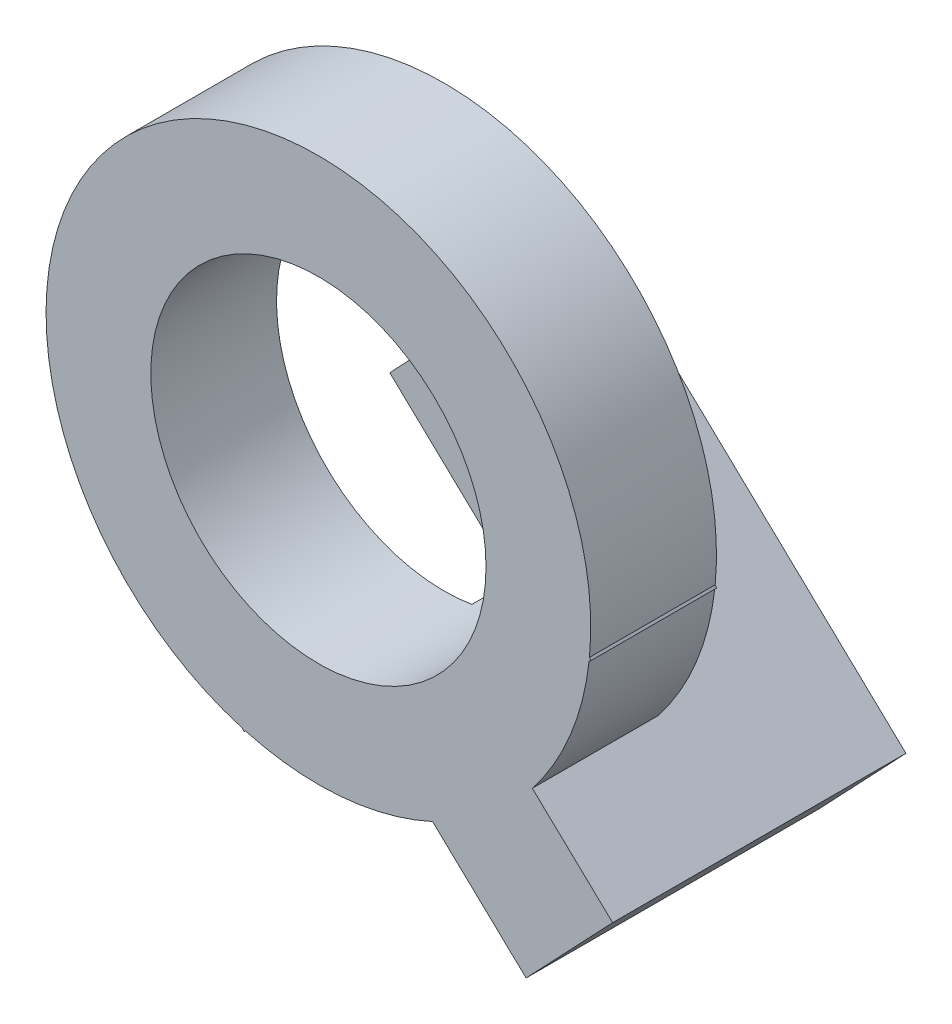
ISO-10303-21;
HEADER;
FILE_DESCRIPTION(('STEP AP214'),'2;1');
FILE_NAME('part.step','',(''),(''),'','','');
FILE_SCHEMA(('AUTOMOTIVE_DESIGN { 1 0 10303 214 1 1 1 1 }'));
ENDSEC;
DATA;
#1=APPLICATION_CONTEXT('core data for automotive mechanical design processes');
#2=APPLICATION_PROTOCOL_DEFINITION('international standard','automotive_design',2000,#1);
#3=PRODUCT_CONTEXT('',#1,'mechanical');
#4=PRODUCT('Part','Part','',(#3));
#5=PRODUCT_RELATED_PRODUCT_CATEGORY('part','',(#4));
#6=PRODUCT_DEFINITION_FORMATION('','',#4);
#7=PRODUCT_DEFINITION_CONTEXT('part definition',#1,'design');
#8=PRODUCT_DEFINITION('design','',#6,#7);
#9=PRODUCT_DEFINITION_SHAPE('','',#8);
#10=(LENGTH_UNIT() NAMED_UNIT(*) SI_UNIT(.MILLI.,.METRE.));
#11=(NAMED_UNIT(*) PLANE_ANGLE_UNIT() SI_UNIT($,.RADIAN.));
#12=(NAMED_UNIT(*) SI_UNIT($,.STERADIAN.) SOLID_ANGLE_UNIT());
#13=UNCERTAINTY_MEASURE_WITH_UNIT(LENGTH_MEASURE(1.E-05),#10,'distance_accuracy_value','');
#14=(GEOMETRIC_REPRESENTATION_CONTEXT(3) GLOBAL_UNCERTAINTY_ASSIGNED_CONTEXT((#13)) GLOBAL_UNIT_ASSIGNED_CONTEXT((#10,
#11,#12)) REPRESENTATION_CONTEXT('',''));
#15=CARTESIAN_POINT('',(0.,0.,0.));
#16=DIRECTION('',(0.,0.,1.));
#17=DIRECTION('',(1.,0.,0.));
#18=AXIS2_PLACEMENT_3D('',#15,#16,#17);
#19=CARTESIAN_POINT('',(44.03139663398,44.838982649365,57.5));
#20=DIRECTION('',(-0.560562494966211,0.828112123590312,0.));
#21=DIRECTION('',(0.,0.,1.));
#22=AXIS2_PLACEMENT_3D('',#19,#20,#21);
#23=PLANE('',#22);
#24=DIRECTION('',(0.,0.,1.));
#25=VECTOR('',#24,1.);
#26=CARTESIAN_POINT('',(35.750275398078,39.233357699701,57.5));
#27=LINE('',#26,#25);
#28=CARTESIAN_POINT('',(35.750275398078,39.233357699701,57.5));
#29=VERTEX_POINT('',#28);
#30=CARTESIAN_POINT('',(35.750275398078,39.233357699701,60.5));
#31=VERTEX_POINT('',#30);
#32=EDGE_CURVE('E24',#29,#31,#27,.T.);
#33=ORIENTED_EDGE('',*,*,#32,.F.);
#34=DIRECTION('',(-0.828112123590312,-0.560562494966211,0.));
#35=VECTOR('',#34,1.);
#36=CARTESIAN_POINT('',(44.03139663398,44.838982649365,57.5));
#37=LINE('',#36,#35);
#38=CARTESIAN_POINT('',(35.792555747973,39.261977952624,57.5));
#39=VERTEX_POINT('',#38);
#40=EDGE_CURVE('E198',#39,#29,#37,.T.);
#41=ORIENTED_EDGE('',*,*,#40,.F.);
#42=DIRECTION('',(0.,0.,1.));
#43=VECTOR('',#42,1.);
#44=CARTESIAN_POINT('',(35.792555747973,39.261977952624,57.5));
#45=LINE('',#44,#43);
#46=CARTESIAN_POINT('',(35.792555747973,39.261977952624,60.5));
#47=VERTEX_POINT('',#46);
#48=EDGE_CURVE('E9',#39,#47,#45,.T.);
#49=ORIENTED_EDGE('',*,*,#48,.T.);
#50=DIRECTION('',(-0.828112123590312,-0.560562494966211,0.));
#51=VECTOR('',#50,1.);
#52=CARTESIAN_POINT('',(44.03139663398,44.838982649365,60.5));
#53=LINE('',#52,#51);
#54=EDGE_CURVE('E225',#47,#31,#53,.T.);
#55=ORIENTED_EDGE('',*,*,#54,.T.);
#56=EDGE_LOOP('',(#33,#41,#49,#55));
#57=FACE_BOUND('',#56,.T.);
#58=ADVANCED_FACE('F15',(#57),#23,.F.);
#59=CARTESIAN_POINT('',(37.528614996388,45.525850419875,57.5));
#60=DIRECTION('',(0.,0.,1.));
#61=DIRECTION('',(1.,0.,0.));
#62=AXIS2_PLACEMENT_3D('',#59,#60,#61);
#63=CYLINDRICAL_SURFACE('',#62,6.5);
#64=CARTESIAN_POINT('',(37.528614996388,45.525850419875,60.5));
#65=DIRECTION('',(0.,0.,1.));
#66=DIRECTION('',(1.,0.,0.));
#67=AXIS2_PLACEMENT_3D('',#64,#65,#66);
#68=CIRCLE('',#67,6.5);
#69=CARTESIAN_POINT('',(40.253172476418,39.624428003372,60.5));
#70=VERTEX_POINT('',#69);
#71=EDGE_CURVE('E226',#47,#70,#68,.T.);
#72=ORIENTED_EDGE('',*,*,#71,.F.);
#73=ORIENTED_EDGE('',*,*,#48,.F.);
#74=CARTESIAN_POINT('',(37.528614996388,45.525850419875,57.5));
#75=DIRECTION('',(0.,0.,1.));
#76=DIRECTION('',(1.,0.,0.));
#77=AXIS2_PLACEMENT_3D('',#74,#75,#76);
#78=CIRCLE('',#77,6.5);
#79=CARTESIAN_POINT('',(40.253172476418,39.624428003372,57.5));
#80=VERTEX_POINT('',#79);
#81=EDGE_CURVE('E193',#39,#80,#78,.T.);
#82=ORIENTED_EDGE('',*,*,#81,.T.);
#83=DIRECTION('',(0.,0.,1.));
#84=VECTOR('',#83,1.);
#85=CARTESIAN_POINT('',(40.253172476418,39.624428003372,57.5));
#86=LINE('',#85,#84);
#87=EDGE_CURVE('E18',#80,#70,#86,.T.);
#88=ORIENTED_EDGE('',*,*,#87,.T.);
#89=EDGE_LOOP('',(#72,#73,#82,#88));
#90=FACE_BOUND('',#89,.T.);
#91=ADVANCED_FACE('F330',(#90),#63,.T.);
#92=CARTESIAN_POINT('',(35.750275398078,39.233357699701,57.5));
#93=DIRECTION('',(-0.828112123590312,-0.560562494966211,0.));
#94=DIRECTION('',(-0.560562494966211,0.828112123590312,0.));
#95=AXIS2_PLACEMENT_3D('',#92,#93,#94);
#96=PLANE('',#95);
#97=DIRECTION('',(-0.560562494966211,0.828112123590312,0.));
#98=VECTOR('',#97,1.);
#99=CARTESIAN_POINT('',(35.750275398078,39.233357699701,57.5));
#100=LINE('',#99,#98);
#101=CARTESIAN_POINT('',(35.716245277109,39.283629981551,57.5));
#102=VERTEX_POINT('',#101);
#103=EDGE_CURVE('E273',#29,#102,#100,.T.);
#104=ORIENTED_EDGE('',*,*,#103,.F.);
#105=ORIENTED_EDGE('',*,*,#32,.T.);
#106=DIRECTION('',(-0.560562494966211,0.828112123590312,0.));
#107=VECTOR('',#106,1.);
#108=CARTESIAN_POINT('',(35.750275398078,39.233357699701,60.5));
#109=LINE('',#108,#107);
#110=CARTESIAN_POINT('',(35.716245277109,39.283629981551,60.5));
#111=VERTEX_POINT('',#110);
#112=EDGE_CURVE('E210',#31,#111,#109,.T.);
#113=ORIENTED_EDGE('',*,*,#112,.T.);
#114=DIRECTION('',(0.,0.,1.));
#115=VECTOR('',#114,1.);
#116=CARTESIAN_POINT('',(35.716245277109,39.283629981551,57.5));
#117=LINE('',#116,#115);
#118=EDGE_CURVE('E304',#102,#111,#117,.T.);
#119=ORIENTED_EDGE('',*,*,#118,.F.);
#120=EDGE_LOOP('',(#104,#105,#113,#119));
#121=FACE_BOUND('',#120,.T.);
#122=ADVANCED_FACE('F369',(#121),#96,.T.);
#123=CARTESIAN_POINT('',(42.48517600755,37.506335739546,53.5));
#124=DIRECTION('',(0.688354575694027,0.725374371012029,0.));
#125=DIRECTION('',(0.,0.,-1.));
#126=AXIS2_PLACEMENT_3D('',#123,#124,#125);
#127=PLANE('',#126);
#128=ORIENTED_EDGE('',*,*,#87,.F.);
#129=DIRECTION('',(0.725374371012029,-0.688354575694027,0.));
#130=VECTOR('',#129,1.);
#131=CARTESIAN_POINT('',(38.191251341143,41.581118100109,57.5));
#132=LINE('',#131,#130);
#133=CARTESIAN_POINT('',(38.191251341143,41.581118100109,57.5));
#134=VERTEX_POINT('',#133);
#135=EDGE_CURVE('E197',#134,#80,#132,.T.);
#136=ORIENTED_EDGE('',*,*,#135,.F.);
#137=DIRECTION('',(0.,0.,1.));
#138=VECTOR('',#137,1.);
#139=CARTESIAN_POINT('',(38.191251341143,41.581118100109,56.5));
#140=LINE('',#139,#138);
#141=CARTESIAN_POINT('',(38.191251341143,41.581118100109,56.5));
#142=VERTEX_POINT('',#141);
#143=EDGE_CURVE('E243',#142,#134,#140,.T.);
#144=ORIENTED_EDGE('',*,*,#143,.F.);
#145=DIRECTION('',(0.725374371012029,-0.688354575694027,0.));
#146=VECTOR('',#145,1.);
#147=CARTESIAN_POINT('',(39.179053111167,40.643729221418,56.5));
#148=LINE('',#147,#146);
#149=CARTESIAN_POINT('',(35.231432297427,44.389881496483,56.5));
#150=VERTEX_POINT('',#149);
#151=EDGE_CURVE('E239',#150,#142,#148,.T.);
#152=ORIENTED_EDGE('',*,*,#151,.F.);
#153=DIRECTION('',(0.,0.,1.));
#154=VECTOR('',#153,1.);
#155=CARTESIAN_POINT('',(35.231432297427,44.389881496483,53.5));
#156=LINE('',#155,#154);
#157=CARTESIAN_POINT('',(35.231432297427,44.389881496483,53.5));
#158=VERTEX_POINT('',#157);
#159=EDGE_CURVE('E305',#158,#150,#156,.T.);
#160=ORIENTED_EDGE('',*,*,#159,.F.);
#161=DIRECTION('',(-0.725374371012029,0.688354575694027,0.));
#162=VECTOR('',#161,1.);
#163=CARTESIAN_POINT('',(42.48517600755,37.506335739546,53.5));
#164=LINE('',#163,#162);
#165=CARTESIAN_POINT('',(42.48517600755,37.506335739546,53.5));
#166=VERTEX_POINT('',#165);
#167=EDGE_CURVE('E46',#166,#158,#164,.T.);
#168=ORIENTED_EDGE('',*,*,#167,.F.);
#169=DIRECTION('',(0.,0.,1.));
#170=VECTOR('',#169,1.);
#171=CARTESIAN_POINT('',(42.48517600755,37.506335739546,53.5));
#172=LINE('',#171,#170);
#173=CARTESIAN_POINT('',(42.48517600755,37.506335739546,60.5));
#174=VERTEX_POINT('',#173);
#175=EDGE_CURVE('E40',#166,#174,#172,.T.);
#176=ORIENTED_EDGE('',*,*,#175,.T.);
#177=DIRECTION('',(-0.725374371012029,0.688354575694027,0.));
#178=VECTOR('',#177,1.);
#179=CARTESIAN_POINT('',(42.48517600755,37.506335739546,60.5));
#180=LINE('',#179,#178);
#181=EDGE_CURVE('E201',#174,#70,#180,.T.);
#182=ORIENTED_EDGE('',*,*,#181,.T.);
#183=EDGE_LOOP('',(#128,#136,#144,#152,#160,#168,#176,#182));
#184=FACE_BOUND('',#183,.T.);
#185=ADVANCED_FACE('F335',(#184),#127,.F.);
#186=CARTESIAN_POINT('',(42.48517600755,37.506335739546,53.5));
#187=DIRECTION('',(-0.725374371012029,0.688354575694027,0.));
#188=DIRECTION('',(0.,0.,1.));
#189=AXIS2_PLACEMENT_3D('',#186,#187,#188);
#190=PLANE('',#189);
#191=DIRECTION('',(0.,0.,1.));
#192=VECTOR('',#191,1.);
#193=CARTESIAN_POINT('',(44.550239734631,39.682458852583,53.5));
#194=LINE('',#193,#192);
#195=CARTESIAN_POINT('',(44.550239734631,39.682458852583,53.5));
#196=VERTEX_POINT('',#195);
#197=CARTESIAN_POINT('',(44.550239734631,39.682458852583,60.5));
#198=VERTEX_POINT('',#197);
#199=EDGE_CURVE('E257',#196,#198,#194,.T.);
#200=ORIENTED_EDGE('',*,*,#199,.T.);
#201=DIRECTION('',(0.688354575694027,0.725374371012029,0.));
#202=VECTOR('',#201,1.);
#203=CARTESIAN_POINT('',(42.48517600755,37.506335739546,60.5));
#204=LINE('',#203,#202);
#205=EDGE_CURVE('E196',#174,#198,#204,.T.);
#206=ORIENTED_EDGE('',*,*,#205,.F.);
#207=ORIENTED_EDGE('',*,*,#175,.F.);
#208=DIRECTION('',(0.688354575694027,0.725374371012029,0.));
#209=VECTOR('',#208,1.);
#210=CARTESIAN_POINT('',(42.48517600755,37.506335739546,53.5));
#211=LINE('',#210,#209);
#212=EDGE_CURVE('E312',#166,#196,#211,.T.);
#213=ORIENTED_EDGE('',*,*,#212,.T.);
#214=EDGE_LOOP('',(#200,#206,#207,#213));
#215=FACE_BOUND('',#214,.T.);
#216=ADVANCED_FACE('F358',(#215),#190,.F.);
#217=CARTESIAN_POINT('',(42.48517600755,37.506335739546,53.5));
#218=DIRECTION('',(0.,0.,1.));
#219=DIRECTION('',(1.,0.,0.));
#220=AXIS2_PLACEMENT_3D('',#217,#218,#219);
#221=PLANE('',#220);
#222=DIRECTION('',(0.688354575694027,0.725374371012029,0.));
#223=VECTOR('',#222,1.);
#224=CARTESIAN_POINT('',(35.231432297427,44.389881496483,53.5));
#225=LINE('',#224,#223);
#226=CARTESIAN_POINT('',(37.296496024508,46.56600460952,53.5));
#227=VERTEX_POINT('',#226);
#228=EDGE_CURVE('E285',#158,#227,#225,.T.);
#229=ORIENTED_EDGE('',*,*,#228,.T.);
#230=DIRECTION('',(-0.725374371012029,0.688354575694027,0.));
#231=VECTOR('',#230,1.);
#232=CARTESIAN_POINT('',(44.550239734631,39.682458852583,53.5));
#233=LINE('',#232,#231);
#234=EDGE_CURVE('E263',#196,#227,#233,.T.);
#235=ORIENTED_EDGE('',*,*,#234,.F.);
#236=ORIENTED_EDGE('',*,*,#212,.F.);
#237=ORIENTED_EDGE('',*,*,#167,.T.);
#238=EDGE_LOOP('',(#229,#235,#236,#237));
#239=FACE_BOUND('',#238,.T.);
#240=ADVANCED_FACE('F356',(#239),#221,.F.);
#241=CARTESIAN_POINT('',(35.231432297427,44.389881496483,53.5));
#242=DIRECTION('',(-0.725374371012029,0.688354575694027,0.));
#243=DIRECTION('',(0.,0.,1.));
#244=AXIS2_PLACEMENT_3D('',#241,#242,#243);
#245=PLANE('',#244);
#246=DIRECTION('',(0.,0.,1.));
#247=VECTOR('',#246,1.);
#248=CARTESIAN_POINT('',(37.296496024508,46.56600460952,53.5));
#249=LINE('',#248,#247);
#250=CARTESIAN_POINT('',(37.296496024508,46.56600460952,56.5));
#251=VERTEX_POINT('',#250);
#252=EDGE_CURVE('E295',#227,#251,#249,.T.);
#253=ORIENTED_EDGE('',*,*,#252,.F.);
#254=ORIENTED_EDGE('',*,*,#228,.F.);
#255=ORIENTED_EDGE('',*,*,#159,.T.);
#256=DIRECTION('',(0.688354575694027,0.725374371012029,0.));
#257=VECTOR('',#256,1.);
#258=CARTESIAN_POINT('',(36.059274688229,45.262245354776,56.5));
#259=LINE('',#258,#257);
#260=EDGE_CURVE('E242',#150,#251,#259,.T.);
#261=ORIENTED_EDGE('',*,*,#260,.T.);
#262=EDGE_LOOP('',(#253,#254,#255,#261));
#263=FACE_BOUND('',#262,.T.);
#264=ADVANCED_FACE('F352',(#263),#245,.T.);
#265=CARTESIAN_POINT('',(37.528614996388,45.525850419875,56.5));
#266=DIRECTION('',(0.,0.,1.));
#267=DIRECTION('',(1.,0.,0.));
#268=AXIS2_PLACEMENT_3D('',#265,#266,#267);
#269=PLANE('',#268);
#270=ORIENTED_EDGE('',*,*,#151,.T.);
#271=CARTESIAN_POINT('',(37.528614996388,45.525850419875,56.5));
#272=DIRECTION('',(0.,0.,1.));
#273=DIRECTION('',(1.,0.,0.));
#274=AXIS2_PLACEMENT_3D('',#271,#272,#273);
#275=CIRCLE('',#274,4.);
#276=CARTESIAN_POINT('',(40.807242216564,43.23443087053,56.5));
#277=VERTEX_POINT('',#276);
#278=EDGE_CURVE('E252',#142,#277,#275,.T.);
#279=ORIENTED_EDGE('',*,*,#278,.T.);
#280=DIRECTION('',(0.725374371012029,-0.688354575694027,0.));
#281=VECTOR('',#280,1.);
#282=CARTESIAN_POINT('',(41.244116838248,42.819852334455,56.5));
#283=LINE('',#282,#281);
#284=EDGE_CURVE('E294',#251,#277,#283,.T.);
#285=ORIENTED_EDGE('',*,*,#284,.F.);
#286=ORIENTED_EDGE('',*,*,#260,.F.);
#287=EDGE_LOOP('',(#270,#279,#285,#286));
#288=FACE_BOUND('',#287,.T.);
#289=ADVANCED_FACE('F347',(#288),#269,.T.);
#290=CARTESIAN_POINT('',(37.528614996388,45.525850419875,56.5));
#291=DIRECTION('',(0.,0.,1.));
#292=DIRECTION('',(1.,0.,0.));
#293=AXIS2_PLACEMENT_3D('',#290,#291,#292);
#294=CYLINDRICAL_SURFACE('',#293,4.);
#295=DIRECTION('',(0.,0.,1.));
#296=VECTOR('',#295,1.);
#297=CARTESIAN_POINT('',(41.528614996388,45.525850419875,56.5));
#298=LINE('',#297,#296);
#299=CARTESIAN_POINT('',(41.528614996388,45.525850419875,57.5));
#300=VERTEX_POINT('',#299);
#301=CARTESIAN_POINT('',(41.528614996388,45.525850419875,60.5));
#302=VERTEX_POINT('',#301);
#303=EDGE_CURVE('E306',#300,#302,#298,.T.);
#304=ORIENTED_EDGE('',*,*,#303,.F.);
#305=CARTESIAN_POINT('',(37.528614996388,45.525850419875,57.5));
#306=DIRECTION('',(0.,0.,1.));
#307=DIRECTION('',(1.,0.,0.));
#308=AXIS2_PLACEMENT_3D('',#305,#306,#307);
#309=CIRCLE('',#308,4.);
#310=CARTESIAN_POINT('',(40.807242216564,43.23443087053,57.5));
#311=VERTEX_POINT('',#310);
#312=EDGE_CURVE('E254',#311,#300,#309,.T.);
#313=ORIENTED_EDGE('',*,*,#312,.F.);
#314=DIRECTION('',(0.,0.,1.));
#315=VECTOR('',#314,1.);
#316=CARTESIAN_POINT('',(40.807242216564,43.23443087053,56.5));
#317=LINE('',#316,#315);
#318=EDGE_CURVE('E297',#277,#311,#317,.T.);
#319=ORIENTED_EDGE('',*,*,#318,.F.);
#320=ORIENTED_EDGE('',*,*,#278,.F.);
#321=ORIENTED_EDGE('',*,*,#143,.T.);
#322=CARTESIAN_POINT('',(37.528614996388,45.525850419875,57.5));
#323=DIRECTION('',(0.,0.,1.));
#324=DIRECTION('',(1.,0.,0.));
#325=AXIS2_PLACEMENT_3D('',#322,#323,#324);
#326=CIRCLE('',#325,4.);
#327=EDGE_CURVE('E259',#300,#134,#326,.T.);
#328=ORIENTED_EDGE('',*,*,#327,.F.);
#329=ORIENTED_EDGE('',*,*,#303,.T.);
#330=CARTESIAN_POINT('',(37.528614996388,45.525850419875,60.5));
#331=DIRECTION('',(0.,0.,-1.));
#332=DIRECTION('',(1.,0.,0.));
#333=AXIS2_PLACEMENT_3D('',#330,#331,#332);
#334=CIRCLE('',#333,4.);
#335=EDGE_CURVE('E237',#302,#302,#334,.T.);
#336=ORIENTED_EDGE('',*,*,#335,.F.);
#337=EDGE_LOOP('',(#304,#313,#319,#320,#321,#328,#329,#336));
#338=FACE_BOUND('',#337,.T.);
#339=ADVANCED_FACE('F344',(#338),#294,.F.);
#340=CARTESIAN_POINT('',(37.528614996388,45.525850419875,57.5));
#341=DIRECTION('',(0.,0.,1.));
#342=DIRECTION('',(1.,0.,0.));
#343=AXIS2_PLACEMENT_3D('',#340,#341,#342);
#344=CYLINDRICAL_SURFACE('',#343,6.5);
#345=CARTESIAN_POINT('',(37.528614996388,45.525850419875,57.5));
#346=DIRECTION('',(0.,0.,-1.));
#347=DIRECTION('',(-0.278826110658059,-0.960341605896204,0.));
#348=AXIS2_PLACEMENT_3D('',#345,#346,#347);
#349=CIRCLE('',#348,6.5);
#350=CARTESIAN_POINT('',(43.997366513011,44.889254931214,57.5));
#351=VERTEX_POINT('',#350);
#352=EDGE_CURVE('E279',#102,#351,#349,.T.);
#353=ORIENTED_EDGE('',*,*,#352,.F.);
#354=ORIENTED_EDGE('',*,*,#118,.T.);
#355=CARTESIAN_POINT('',(37.528614996388,45.525850419875,60.5));
#356=DIRECTION('',(0.,0.,1.));
#357=DIRECTION('',(0.995192541018966,-0.0979377674863666,0.));
#358=AXIS2_PLACEMENT_3D('',#355,#356,#357);
#359=CIRCLE('',#358,6.5);
#360=CARTESIAN_POINT('',(43.997366513011,44.889254931214,60.5));
#361=VERTEX_POINT('',#360);
#362=EDGE_CURVE('E204',#361,#111,#359,.T.);
#363=ORIENTED_EDGE('',*,*,#362,.F.);
#364=DIRECTION('',(0.,0.,1.));
#365=VECTOR('',#364,1.);
#366=CARTESIAN_POINT('',(43.997366513011,44.889254931214,57.5));
#367=LINE('',#366,#365);
#368=EDGE_CURVE('E262',#351,#361,#367,.T.);
#369=ORIENTED_EDGE('',*,*,#368,.F.);
#370=EDGE_LOOP('',(#353,#354,#363,#369));
#371=FACE_BOUND('',#370,.T.);
#372=ADVANCED_FACE('F370',(#371),#344,.T.);
#373=CARTESIAN_POINT('',(44.550239734631,39.682458852583,53.5));
#374=DIRECTION('',(0.688354575694027,0.725374371012029,0.));
#375=DIRECTION('',(0.,0.,-1.));
#376=AXIS2_PLACEMENT_3D('',#373,#374,#375);
#377=PLANE('',#376);
#378=DIRECTION('',(-0.725374371012029,0.688354575694027,0.));
#379=VECTOR('',#378,1.);
#380=CARTESIAN_POINT('',(44.550239734631,39.682458852583,60.5));
#381=LINE('',#380,#379);
#382=CARTESIAN_POINT('',(42.633150498099,41.501708609282,60.5));
#383=VERTEX_POINT('',#382);
#384=EDGE_CURVE('E205',#198,#383,#381,.T.);
#385=ORIENTED_EDGE('',*,*,#384,.F.);
#386=ORIENTED_EDGE('',*,*,#199,.F.);
#387=ORIENTED_EDGE('',*,*,#234,.T.);
#388=ORIENTED_EDGE('',*,*,#252,.T.);
#389=ORIENTED_EDGE('',*,*,#284,.T.);
#390=ORIENTED_EDGE('',*,*,#318,.T.);
#391=DIRECTION('',(-0.725374371012029,0.688354575694027,0.));
#392=VECTOR('',#391,1.);
#393=CARTESIAN_POINT('',(42.633150498099,41.501708609282,57.5));
#394=LINE('',#393,#392);
#395=CARTESIAN_POINT('',(42.633150498099,41.501708609282,57.5));
#396=VERTEX_POINT('',#395);
#397=EDGE_CURVE('E168',#396,#311,#394,.T.);
#398=ORIENTED_EDGE('',*,*,#397,.F.);
#399=DIRECTION('',(0.,0.,1.));
#400=VECTOR('',#399,1.);
#401=CARTESIAN_POINT('',(42.633150498099,41.501708609282,57.5));
#402=LINE('',#401,#400);
#403=EDGE_CURVE('E167',#396,#383,#402,.T.);
#404=ORIENTED_EDGE('',*,*,#403,.T.);
#405=EDGE_LOOP('',(#385,#386,#387,#388,#389,#390,#398,#404));
#406=FACE_BOUND('',#405,.T.);
#407=ADVANCED_FACE('F363',(#406),#377,.T.);
#408=CARTESIAN_POINT('',(44.03139663398,44.838982649365,57.5));
#409=DIRECTION('',(-0.828112123590312,-0.560562494966211,0.));
#410=DIRECTION('',(-0.560562494966211,0.828112123590312,0.));
#411=AXIS2_PLACEMENT_3D('',#408,#409,#410);
#412=PLANE('',#411);
#413=ORIENTED_EDGE('',*,*,#368,.T.);
#414=DIRECTION('',(-0.560562494966211,0.828112123590312,0.));
#415=VECTOR('',#414,1.);
#416=CARTESIAN_POINT('',(44.03139663398,44.838982649365,60.5));
#417=LINE('',#416,#415);
#418=CARTESIAN_POINT('',(44.03139663398,44.838982649365,60.5));
#419=VERTEX_POINT('',#418);
#420=EDGE_CURVE('E208',#419,#361,#417,.T.);
#421=ORIENTED_EDGE('',*,*,#420,.F.);
#422=DIRECTION('',(0.,0.,1.));
#423=VECTOR('',#422,1.);
#424=CARTESIAN_POINT('',(44.03139663398,44.838982649365,57.5));
#425=LINE('',#424,#423);
#426=CARTESIAN_POINT('',(44.03139663398,44.838982649365,57.5));
#427=VERTEX_POINT('',#426);
#428=EDGE_CURVE('E181',#427,#419,#425,.T.);
#429=ORIENTED_EDGE('',*,*,#428,.F.);
#430=DIRECTION('',(-0.560562494966211,0.828112123590312,0.));
#431=VECTOR('',#430,1.);
#432=CARTESIAN_POINT('',(44.03139663398,44.838982649365,57.5));
#433=LINE('',#432,#431);
#434=EDGE_CURVE('E180',#427,#351,#433,.T.);
#435=ORIENTED_EDGE('',*,*,#434,.T.);
#436=EDGE_LOOP('',(#413,#421,#429,#435));
#437=FACE_BOUND('',#436,.T.);
#438=ADVANCED_FACE('F361',(#437),#412,.F.);
#439=CARTESIAN_POINT('',(44.03139663398,44.838982649365,57.5));
#440=DIRECTION('',(0.,0.,1.));
#441=DIRECTION('',(1.,0.,0.));
#442=AXIS2_PLACEMENT_3D('',#439,#440,#441);
#443=PLANE('',#442);
#444=CARTESIAN_POINT('',(37.528614996388,45.525850419875,57.5));
#445=DIRECTION('',(0.,0.,1.));
#446=DIRECTION('',(1.,0.,0.));
#447=AXIS2_PLACEMENT_3D('',#444,#445,#446);
#448=CIRCLE('',#447,6.5);
#449=CARTESIAN_POINT('',(43.989116284084,44.810362396442,57.5));
#450=VERTEX_POINT('',#449);
#451=EDGE_CURVE('E159',#396,#450,#448,.T.);
#452=ORIENTED_EDGE('',*,*,#451,.F.);
#453=ORIENTED_EDGE('',*,*,#397,.T.);
#454=ORIENTED_EDGE('',*,*,#312,.T.);
#455=ORIENTED_EDGE('',*,*,#327,.T.);
#456=ORIENTED_EDGE('',*,*,#135,.T.);
#457=ORIENTED_EDGE('',*,*,#81,.F.);
#458=ORIENTED_EDGE('',*,*,#40,.T.);
#459=ORIENTED_EDGE('',*,*,#103,.T.);
#460=ORIENTED_EDGE('',*,*,#352,.T.);
#461=ORIENTED_EDGE('',*,*,#434,.F.);
#462=DIRECTION('',(-0.828112123590312,-0.560562494966211,0.));
#463=VECTOR('',#462,1.);
#464=CARTESIAN_POINT('',(44.03139663398,44.838982649365,57.5));
#465=LINE('',#464,#463);
#466=EDGE_CURVE('E174',#427,#450,#465,.T.);
#467=ORIENTED_EDGE('',*,*,#466,.T.);
#468=EDGE_LOOP('',(#452,#453,#454,#455,#456,#457,#458,#459,#460,#461,#467));
#469=FACE_BOUND('',#468,.T.);
#470=ADVANCED_FACE('F173',(#469),#443,.F.);
#471=CARTESIAN_POINT('',(37.528614996388,45.525850419875,57.5));
#472=DIRECTION('',(0.,0.,1.));
#473=DIRECTION('',(1.,0.,0.));
#474=AXIS2_PLACEMENT_3D('',#471,#472,#473);
#475=CYLINDRICAL_SURFACE('',#474,6.5);
#476=CARTESIAN_POINT('',(37.528614996388,45.525850419875,60.5));
#477=DIRECTION('',(0.,0.,1.));
#478=DIRECTION('',(1.,0.,0.));
#479=AXIS2_PLACEMENT_3D('',#476,#477,#478);
#480=CIRCLE('',#479,6.5);
#481=CARTESIAN_POINT('',(43.989116284084,44.810362396442,60.5));
#482=VERTEX_POINT('',#481);
#483=EDGE_CURVE('E230',#383,#482,#480,.T.);
#484=ORIENTED_EDGE('',*,*,#483,.F.);
#485=ORIENTED_EDGE('',*,*,#403,.F.);
#486=ORIENTED_EDGE('',*,*,#451,.T.);
#487=DIRECTION('',(0.,0.,1.));
#488=VECTOR('',#487,1.);
#489=CARTESIAN_POINT('',(43.989116284084,44.810362396442,57.5));
#490=LINE('',#489,#488);
#491=EDGE_CURVE('E164',#450,#482,#490,.T.);
#492=ORIENTED_EDGE('',*,*,#491,.T.);
#493=EDGE_LOOP('',(#484,#485,#486,#492));
#494=FACE_BOUND('',#493,.T.);
#495=ADVANCED_FACE('F162',(#494),#475,.T.);
#496=CARTESIAN_POINT('',(44.03139663398,44.838982649365,60.5));
#497=DIRECTION('',(0.,0.,1.));
#498=DIRECTION('',(1.,0.,0.));
#499=AXIS2_PLACEMENT_3D('',#496,#497,#498);
#500=PLANE('',#499);
#501=ORIENTED_EDGE('',*,*,#335,.T.);
#502=EDGE_LOOP('',(#501));
#503=FACE_BOUND('',#502,.T.);
#504=DIRECTION('',(-0.828112123590312,-0.560562494966211,0.));
#505=VECTOR('',#504,1.);
#506=CARTESIAN_POINT('',(44.03139663398,44.838982649365,60.5));
#507=LINE('',#506,#505);
#508=EDGE_CURVE('E190',#419,#482,#507,.T.);
#509=ORIENTED_EDGE('',*,*,#508,.F.);
#510=ORIENTED_EDGE('',*,*,#420,.T.);
#511=ORIENTED_EDGE('',*,*,#362,.T.);
#512=ORIENTED_EDGE('',*,*,#112,.F.);
#513=ORIENTED_EDGE('',*,*,#54,.F.);
#514=ORIENTED_EDGE('',*,*,#71,.T.);
#515=ORIENTED_EDGE('',*,*,#181,.F.);
#516=ORIENTED_EDGE('',*,*,#205,.T.);
#517=ORIENTED_EDGE('',*,*,#384,.T.);
#518=ORIENTED_EDGE('',*,*,#483,.T.);
#519=EDGE_LOOP('',(#509,#510,#511,#512,#513,#514,#515,#516,#517,#518));
#520=FACE_BOUND('',#519,.T.);
#521=ADVANCED_FACE('F331',(#503,#520),#500,.T.);
#522=CARTESIAN_POINT('',(44.03139663398,44.838982649365,57.5));
#523=DIRECTION('',(-0.560562494966211,0.828112123590312,0.));
#524=DIRECTION('',(0.,0.,1.));
#525=AXIS2_PLACEMENT_3D('',#522,#523,#524);
#526=PLANE('',#525);
#527=ORIENTED_EDGE('',*,*,#491,.F.);
#528=ORIENTED_EDGE('',*,*,#466,.F.);
#529=ORIENTED_EDGE('',*,*,#428,.T.);
#530=ORIENTED_EDGE('',*,*,#508,.T.);
#531=EDGE_LOOP('',(#527,#528,#529,#530));
#532=FACE_BOUND('',#531,.T.);
#533=ADVANCED_FACE('F184',(#532),#526,.F.);
#534=CLOSED_SHELL('',(#58,#91,#122,#185,#216,#240,#264,#289,#339,#372,#407,#438,#470,#495,#521,#533));
#535=MANIFOLD_SOLID_BREP('B1',#534);
#536=ADVANCED_BREP_SHAPE_REPRESENTATION('',(#18,#535),#14);
#537=SHAPE_DEFINITION_REPRESENTATION(#9,#536);
ENDSEC;
END-ISO-10303-21;
